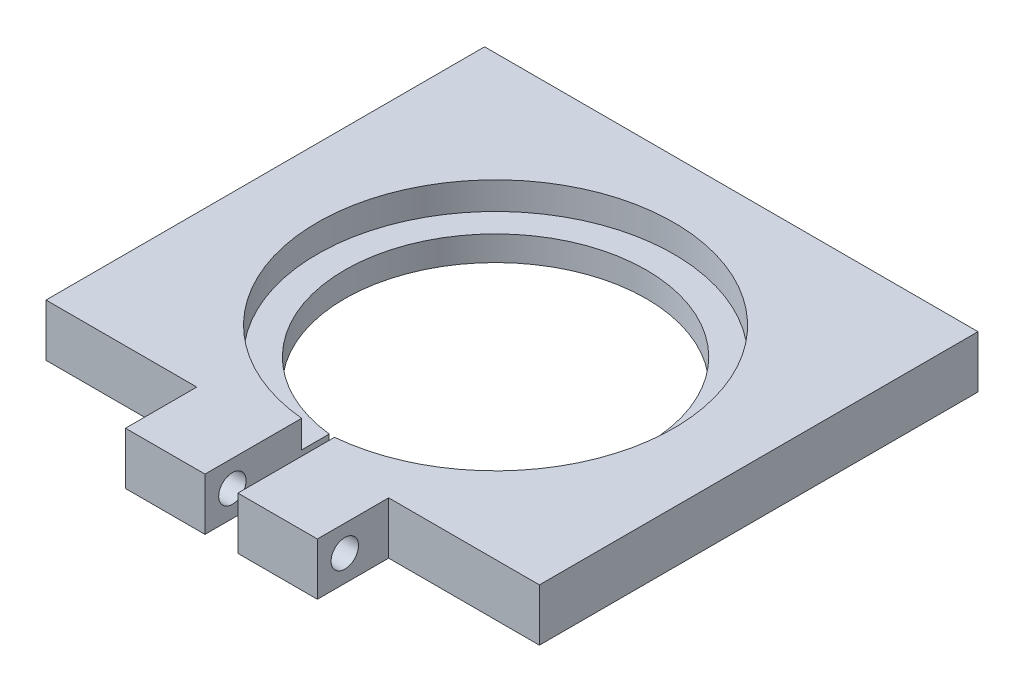
ISO-10303-21;
HEADER;
FILE_DESCRIPTION(('STEP AP214'),'2;1');
FILE_NAME('part.step','',(''),(''),'','','');
FILE_SCHEMA(('AUTOMOTIVE_DESIGN { 1 0 10303 214 1 1 1 1 }'));
ENDSEC;
DATA;
#1=APPLICATION_CONTEXT('core data for automotive mechanical design processes');
#2=APPLICATION_PROTOCOL_DEFINITION('international standard','automotive_design',2000,#1);
#3=PRODUCT_CONTEXT('',#1,'mechanical');
#4=PRODUCT('Part','Part','',(#3));
#5=PRODUCT_RELATED_PRODUCT_CATEGORY('part','',(#4));
#6=PRODUCT_DEFINITION_FORMATION('','',#4);
#7=PRODUCT_DEFINITION_CONTEXT('part definition',#1,'design');
#8=PRODUCT_DEFINITION('design','',#6,#7);
#9=PRODUCT_DEFINITION_SHAPE('','',#8);
#10=(LENGTH_UNIT() NAMED_UNIT(*) SI_UNIT(.MILLI.,.METRE.));
#11=(NAMED_UNIT(*) PLANE_ANGLE_UNIT() SI_UNIT($,.RADIAN.));
#12=(NAMED_UNIT(*) SI_UNIT($,.STERADIAN.) SOLID_ANGLE_UNIT());
#13=UNCERTAINTY_MEASURE_WITH_UNIT(LENGTH_MEASURE(1.E-05),#10,'distance_accuracy_value','');
#14=(GEOMETRIC_REPRESENTATION_CONTEXT(3) GLOBAL_UNCERTAINTY_ASSIGNED_CONTEXT((#13)) GLOBAL_UNIT_ASSIGNED_CONTEXT((#10,
#11,#12)) REPRESENTATION_CONTEXT('',''));
#15=CARTESIAN_POINT('',(0.,0.,0.));
#16=DIRECTION('',(0.,0.,1.));
#17=DIRECTION('',(1.,0.,0.));
#18=AXIS2_PLACEMENT_3D('',#15,#16,#17);
#19=CARTESIAN_POINT('',(-45.,9.53,46.5));
#20=DIRECTION('',(0.,0.,-1.));
#21=DIRECTION('',(-1.,0.,0.));
#22=AXIS2_PLACEMENT_3D('',#19,#20,#21);
#23=PLANE('',#22);
#24=DIRECTION('',(1.,0.,0.));
#25=VECTOR('',#24,1.);
#26=CARTESIAN_POINT('',(-45.,9.53,46.5));
#27=LINE('',#26,#25);
#28=CARTESIAN_POINT('',(3.00000000000001,9.53,46.5));
#29=VERTEX_POINT('',#28);
#30=CARTESIAN_POINT('',(17.5,9.53,46.5));
#31=VERTEX_POINT('',#30);
#32=EDGE_CURVE('E173',#29,#31,#27,.T.);
#33=ORIENTED_EDGE('',*,*,#32,.F.);
#34=DIRECTION('',(0.,1.,0.));
#35=VECTOR('',#34,1.);
#36=CARTESIAN_POINT('',(3.00000000000001,-0.000999999999999265,46.5));
#37=LINE('',#36,#35);
#38=CARTESIAN_POINT('',(3.00000000000001,0.,46.5));
#39=VERTEX_POINT('',#38);
#40=EDGE_CURVE('E136',#39,#29,#37,.T.);
#41=ORIENTED_EDGE('',*,*,#40,.F.);
#42=DIRECTION('',(1.,0.,0.));
#43=VECTOR('',#42,1.);
#44=CARTESIAN_POINT('',(-45.,0.,46.5));
#45=LINE('',#44,#43);
#46=CARTESIAN_POINT('',(17.5,0.,46.5));
#47=VERTEX_POINT('',#46);
#48=EDGE_CURVE('E184',#39,#47,#45,.T.);
#49=ORIENTED_EDGE('',*,*,#48,.T.);
#50=DIRECTION('',(0.,1.,0.));
#51=VECTOR('',#50,1.);
#52=CARTESIAN_POINT('',(17.5,-0.000999999999999265,46.5));
#53=LINE('',#52,#51);
#54=EDGE_CURVE('E227',#47,#31,#53,.T.);
#55=ORIENTED_EDGE('',*,*,#54,.T.);
#56=EDGE_LOOP('',(#33,#41,#49,#55));
#57=FACE_BOUND('',#56,.T.);
#58=ADVANCED_FACE('F31',(#57),#23,.F.);
#59=CARTESIAN_POINT('',(-45.,9.53,-46.5));
#60=DIRECTION('',(0.,0.,-1.));
#61=DIRECTION('',(-1.,0.,0.));
#62=AXIS2_PLACEMENT_3D('',#59,#60,#61);
#63=PLANE('',#62);
#64=CARTESIAN_POINT('',(-40.,4.765,-46.5));
#65=DIRECTION('',(0.,0.,-1.));
#66=DIRECTION('',(-1.,0.,0.));
#67=AXIS2_PLACEMENT_3D('',#64,#65,#66);
#68=CIRCLE('',#67,2.6);
#69=CARTESIAN_POINT('',(-42.6,4.765,-46.5));
#70=VERTEX_POINT('',#69);
#71=EDGE_CURVE('E239',#70,#70,#68,.T.);
#72=ORIENTED_EDGE('',*,*,#71,.F.);
#73=EDGE_LOOP('',(#72));
#74=FACE_BOUND('',#73,.T.);
#75=CARTESIAN_POINT('',(-25.,4.76000000000003,-46.5));
#76=DIRECTION('',(0.,0.,-1.));
#77=DIRECTION('',(-1.,0.,0.));
#78=AXIS2_PLACEMENT_3D('',#75,#76,#77);
#79=CIRCLE('',#78,2.6);
#80=CARTESIAN_POINT('',(-27.6,4.76000000000003,-46.5));
#81=VERTEX_POINT('',#80);
#82=EDGE_CURVE('E245',#81,#81,#79,.T.);
#83=ORIENTED_EDGE('',*,*,#82,.F.);
#84=EDGE_LOOP('',(#83));
#85=FACE_BOUND('',#84,.T.);
#86=CARTESIAN_POINT('',(25.,4.765,-46.5));
#87=DIRECTION('',(0.,0.,-1.));
#88=DIRECTION('',(-1.,0.,0.));
#89=AXIS2_PLACEMENT_3D('',#86,#87,#88);
#90=CIRCLE('',#89,2.6);
#91=CARTESIAN_POINT('',(22.4,4.765,-46.5));
#92=VERTEX_POINT('',#91);
#93=EDGE_CURVE('E251',#92,#92,#90,.T.);
#94=ORIENTED_EDGE('',*,*,#93,.F.);
#95=EDGE_LOOP('',(#94));
#96=FACE_BOUND('',#95,.T.);
#97=CARTESIAN_POINT('',(40.,4.76499999999999,-46.5));
#98=DIRECTION('',(0.,0.,-1.));
#99=DIRECTION('',(-1.,0.,0.));
#100=AXIS2_PLACEMENT_3D('',#97,#98,#99);
#101=CIRCLE('',#100,2.6);
#102=CARTESIAN_POINT('',(37.4,4.76499999999999,-46.5));
#103=VERTEX_POINT('',#102);
#104=EDGE_CURVE('E162',#103,#103,#101,.T.);
#105=ORIENTED_EDGE('',*,*,#104,.F.);
#106=EDGE_LOOP('',(#105));
#107=FACE_BOUND('',#106,.T.);
#108=DIRECTION('',(1.,0.,0.));
#109=VECTOR('',#108,1.);
#110=CARTESIAN_POINT('',(-45.,0.,-46.5));
#111=LINE('',#110,#109);
#112=CARTESIAN_POINT('',(-45.,0.,-46.5));
#113=VERTEX_POINT('',#112);
#114=CARTESIAN_POINT('',(45.,0.,-46.5));
#115=VERTEX_POINT('',#114);
#116=EDGE_CURVE('E159',#113,#115,#111,.T.);
#117=ORIENTED_EDGE('',*,*,#116,.F.);
#118=DIRECTION('',(0.,-1.,0.));
#119=VECTOR('',#118,1.);
#120=CARTESIAN_POINT('',(-45.,9.53,-46.5));
#121=LINE('',#120,#119);
#122=CARTESIAN_POINT('',(-45.,9.53,-46.5));
#123=VERTEX_POINT('',#122);
#124=EDGE_CURVE('E11',#123,#113,#121,.T.);
#125=ORIENTED_EDGE('',*,*,#124,.F.);
#126=DIRECTION('',(1.,0.,0.));
#127=VECTOR('',#126,1.);
#128=CARTESIAN_POINT('',(-45.,9.53,-46.5));
#129=LINE('',#128,#127);
#130=CARTESIAN_POINT('',(45.,9.53,-46.5));
#131=VERTEX_POINT('',#130);
#132=EDGE_CURVE('E166',#123,#131,#129,.T.);
#133=ORIENTED_EDGE('',*,*,#132,.T.);
#134=DIRECTION('',(0.,-1.,0.));
#135=VECTOR('',#134,1.);
#136=CARTESIAN_POINT('',(45.,9.53,-46.5));
#137=LINE('',#136,#135);
#138=EDGE_CURVE('E40',#131,#115,#137,.T.);
#139=ORIENTED_EDGE('',*,*,#138,.T.);
#140=EDGE_LOOP('',(#117,#125,#133,#139));
#141=FACE_BOUND('',#140,.T.);
#142=ADVANCED_FACE('F33',(#74,#85,#96,#107,#141),#63,.T.);
#143=CARTESIAN_POINT('',(-45.,9.53,-46.5));
#144=DIRECTION('',(1.,0.,0.));
#145=DIRECTION('',(0.,0.,-1.));
#146=AXIS2_PLACEMENT_3D('',#143,#144,#145);
#147=PLANE('',#146);
#148=DIRECTION('',(0.,0.,1.));
#149=VECTOR('',#148,1.);
#150=CARTESIAN_POINT('',(-45.,0.,-46.5));
#151=LINE('',#150,#149);
#152=CARTESIAN_POINT('',(-45.,0.,33.5));
#153=VERTEX_POINT('',#152);
#154=EDGE_CURVE('E170',#113,#153,#151,.T.);
#155=ORIENTED_EDGE('',*,*,#154,.T.);
#156=DIRECTION('',(0.,1.,0.));
#157=VECTOR('',#156,1.);
#158=CARTESIAN_POINT('',(-45.,-0.000999999999999265,33.5));
#159=LINE('',#158,#157);
#160=CARTESIAN_POINT('',(-45.,9.53,33.5));
#161=VERTEX_POINT('',#160);
#162=EDGE_CURVE('E211',#153,#161,#159,.T.);
#163=ORIENTED_EDGE('',*,*,#162,.T.);
#164=DIRECTION('',(0.,0.,1.));
#165=VECTOR('',#164,1.);
#166=CARTESIAN_POINT('',(-45.,9.53,-46.5));
#167=LINE('',#166,#165);
#168=EDGE_CURVE('E176',#123,#161,#167,.T.);
#169=ORIENTED_EDGE('',*,*,#168,.F.);
#170=ORIENTED_EDGE('',*,*,#124,.T.);
#171=EDGE_LOOP('',(#155,#163,#169,#170));
#172=FACE_BOUND('',#171,.T.);
#173=ADVANCED_FACE('F209',(#172),#147,.F.);
#174=CARTESIAN_POINT('',(-17.5,0.,46.5));
#175=VERTEX_POINT('',#174);
#176=CARTESIAN_POINT('',(-2.99999999999999,0.,46.5));
#177=VERTEX_POINT('',#176);
#178=EDGE_CURVE('E185',#175,#177,#45,.T.);
#179=ORIENTED_EDGE('',*,*,#178,.T.);
#180=DIRECTION('',(0.,1.,0.));
#181=VECTOR('',#180,1.);
#182=CARTESIAN_POINT('',(-2.99999999999999,-0.000999999999999265,46.5));
#183=LINE('',#182,#181);
#184=CARTESIAN_POINT('',(-2.99999999999999,9.53,46.5));
#185=VERTEX_POINT('',#184);
#186=EDGE_CURVE('E504',#177,#185,#183,.T.);
#187=ORIENTED_EDGE('',*,*,#186,.T.);
#188=CARTESIAN_POINT('',(-17.5,9.53,46.5));
#189=VERTEX_POINT('',#188);
#190=EDGE_CURVE('E174',#189,#185,#27,.T.);
#191=ORIENTED_EDGE('',*,*,#190,.F.);
#192=DIRECTION('',(0.,1.,0.));
#193=VECTOR('',#192,1.);
#194=CARTESIAN_POINT('',(-17.5,-0.000999999999999265,46.5));
#195=LINE('',#194,#193);
#196=EDGE_CURVE('E522',#175,#189,#195,.T.);
#197=ORIENTED_EDGE('',*,*,#196,.F.);
#198=EDGE_LOOP('',(#179,#187,#191,#197));
#199=FACE_BOUND('',#198,.T.);
#200=ADVANCED_FACE('F269',(#199),#23,.F.);
#201=CARTESIAN_POINT('',(45.,9.53,-46.5));
#202=DIRECTION('',(1.,0.,0.));
#203=DIRECTION('',(0.,0.,-1.));
#204=AXIS2_PLACEMENT_3D('',#201,#202,#203);
#205=PLANE('',#204);
#206=DIRECTION('',(0.,1.,0.));
#207=VECTOR('',#206,1.);
#208=CARTESIAN_POINT('',(45.,-0.000999999999999265,33.5));
#209=LINE('',#208,#207);
#210=CARTESIAN_POINT('',(45.,0.,33.5));
#211=VERTEX_POINT('',#210);
#212=CARTESIAN_POINT('',(45.,9.53,33.5));
#213=VERTEX_POINT('',#212);
#214=EDGE_CURVE('E197',#211,#213,#209,.T.);
#215=ORIENTED_EDGE('',*,*,#214,.F.);
#216=DIRECTION('',(0.,0.,1.));
#217=VECTOR('',#216,1.);
#218=CARTESIAN_POINT('',(45.,0.,-46.5));
#219=LINE('',#218,#217);
#220=EDGE_CURVE('E181',#115,#211,#219,.T.);
#221=ORIENTED_EDGE('',*,*,#220,.F.);
#222=ORIENTED_EDGE('',*,*,#138,.F.);
#223=DIRECTION('',(0.,0.,1.));
#224=VECTOR('',#223,1.);
#225=CARTESIAN_POINT('',(45.,9.53,-46.5));
#226=LINE('',#225,#224);
#227=EDGE_CURVE('E169',#131,#213,#226,.T.);
#228=ORIENTED_EDGE('',*,*,#227,.T.);
#229=EDGE_LOOP('',(#215,#221,#222,#228));
#230=FACE_BOUND('',#229,.T.);
#231=ADVANCED_FACE('F196',(#230),#205,.T.);
#232=CARTESIAN_POINT('',(45.,9.53,-46.5));
#233=DIRECTION('',(0.,-1.,0.));
#234=DIRECTION('',(0.,0.,-1.));
#235=AXIS2_PLACEMENT_3D('',#232,#233,#234);
#236=PLANE('',#235);
#237=CARTESIAN_POINT('',(0.,9.53,-3.49999999999999));
#238=DIRECTION('',(0.,1.,0.));
#239=DIRECTION('',(0.,0.,1.));
#240=AXIS2_PLACEMENT_3D('',#237,#238,#239);
#241=CIRCLE('',#240,32.51);
#242=CARTESIAN_POINT('',(3.00000000000001,9.53,28.8712851150522));
#243=VERTEX_POINT('',#242);
#244=CARTESIAN_POINT('',(-2.99999999999999,9.53,28.8712851150522));
#245=VERTEX_POINT('',#244);
#246=EDGE_CURVE('E148',#243,#245,#241,.T.);
#247=ORIENTED_EDGE('',*,*,#246,.F.);
#248=DIRECTION('',(0.,0.,-1.));
#249=VECTOR('',#248,1.);
#250=CARTESIAN_POINT('',(3.00000000000001,9.53,46.5));
#251=LINE('',#250,#249);
#252=EDGE_CURVE('E131',#29,#243,#251,.T.);
#253=ORIENTED_EDGE('',*,*,#252,.F.);
#254=ORIENTED_EDGE('',*,*,#32,.T.);
#255=DIRECTION('',(0.,0.,1.));
#256=VECTOR('',#255,1.);
#257=CARTESIAN_POINT('',(17.5,9.53,46.5));
#258=LINE('',#257,#256);
#259=CARTESIAN_POINT('',(17.5,9.53,33.5));
#260=VERTEX_POINT('',#259);
#261=EDGE_CURVE('E218',#260,#31,#258,.T.);
#262=ORIENTED_EDGE('',*,*,#261,.F.);
#263=DIRECTION('',(-1.,0.,0.));
#264=VECTOR('',#263,1.);
#265=CARTESIAN_POINT('',(45.,9.53,33.5));
#266=LINE('',#265,#264);
#267=EDGE_CURVE('E216',#213,#260,#266,.T.);
#268=ORIENTED_EDGE('',*,*,#267,.F.);
#269=ORIENTED_EDGE('',*,*,#227,.F.);
#270=ORIENTED_EDGE('',*,*,#132,.F.);
#271=ORIENTED_EDGE('',*,*,#168,.T.);
#272=DIRECTION('',(-1.,0.,0.));
#273=VECTOR('',#272,1.);
#274=CARTESIAN_POINT('',(-45.,9.53,33.5));
#275=LINE('',#274,#273);
#276=CARTESIAN_POINT('',(-17.5,9.53,33.5));
#277=VERTEX_POINT('',#276);
#278=EDGE_CURVE('E520',#277,#161,#275,.T.);
#279=ORIENTED_EDGE('',*,*,#278,.F.);
#280=DIRECTION('',(0.,0.,-1.));
#281=VECTOR('',#280,1.);
#282=CARTESIAN_POINT('',(-17.5,9.53,46.5));
#283=LINE('',#282,#281);
#284=EDGE_CURVE('E517',#189,#277,#283,.T.);
#285=ORIENTED_EDGE('',*,*,#284,.F.);
#286=ORIENTED_EDGE('',*,*,#190,.T.);
#287=DIRECTION('',(0.,0.,1.));
#288=VECTOR('',#287,1.);
#289=CARTESIAN_POINT('',(-2.99999999999999,9.53,46.5));
#290=LINE('',#289,#288);
#291=EDGE_CURVE('E140',#245,#185,#290,.T.);
#292=ORIENTED_EDGE('',*,*,#291,.F.);
#293=EDGE_LOOP('',(#247,#253,#254,#262,#268,#269,#270,#271,#279,#285,#286,#292));
#294=FACE_BOUND('',#293,.T.);
#295=ADVANCED_FACE('F155',(#294),#236,.F.);
#296=CARTESIAN_POINT('',(45.,0.,-46.5));
#297=DIRECTION('',(0.,-1.,0.));
#298=DIRECTION('',(0.,0.,-1.));
#299=AXIS2_PLACEMENT_3D('',#296,#297,#298);
#300=PLANE('',#299);
#301=DIRECTION('',(0.,0.,-1.));
#302=VECTOR('',#301,1.);
#303=CARTESIAN_POINT('',(3.00000000000001,0.,46.5));
#304=LINE('',#303,#302);
#305=CARTESIAN_POINT('',(3.00000000000001,0.,23.8358738656733));
#306=VERTEX_POINT('',#305);
#307=EDGE_CURVE('E141',#39,#306,#304,.T.);
#308=ORIENTED_EDGE('',*,*,#307,.T.);
#309=CARTESIAN_POINT('',(0.,0.,-3.49999999999999));
#310=DIRECTION('',(0.,-1.,0.));
#311=DIRECTION('',(0.,0.,-1.));
#312=AXIS2_PLACEMENT_3D('',#309,#310,#311);
#313=CIRCLE('',#312,27.5);
#314=CARTESIAN_POINT('',(-2.99999999999999,0.,23.8358738656733));
#315=VERTEX_POINT('',#314);
#316=EDGE_CURVE('E235',#306,#315,#313,.F.);
#317=ORIENTED_EDGE('',*,*,#316,.T.);
#318=DIRECTION('',(0.,0.,1.));
#319=VECTOR('',#318,1.);
#320=CARTESIAN_POINT('',(-2.99999999999999,0.,46.5));
#321=LINE('',#320,#319);
#322=EDGE_CURVE('E56',#315,#177,#321,.T.);
#323=ORIENTED_EDGE('',*,*,#322,.T.);
#324=ORIENTED_EDGE('',*,*,#178,.F.);
#325=DIRECTION('',(0.,0.,-1.));
#326=VECTOR('',#325,1.);
#327=CARTESIAN_POINT('',(-17.5,0.,46.5));
#328=LINE('',#327,#326);
#329=CARTESIAN_POINT('',(-17.5,0.,33.5));
#330=VERTEX_POINT('',#329);
#331=EDGE_CURVE('E514',#175,#330,#328,.T.);
#332=ORIENTED_EDGE('',*,*,#331,.T.);
#333=DIRECTION('',(-1.,0.,0.));
#334=VECTOR('',#333,1.);
#335=CARTESIAN_POINT('',(-45.,0.,33.5));
#336=LINE('',#335,#334);
#337=EDGE_CURVE('E206',#330,#153,#336,.T.);
#338=ORIENTED_EDGE('',*,*,#337,.T.);
#339=ORIENTED_EDGE('',*,*,#154,.F.);
#340=ORIENTED_EDGE('',*,*,#116,.T.);
#341=ORIENTED_EDGE('',*,*,#220,.T.);
#342=DIRECTION('',(-1.,0.,0.));
#343=VECTOR('',#342,1.);
#344=CARTESIAN_POINT('',(45.,0.,33.5));
#345=LINE('',#344,#343);
#346=CARTESIAN_POINT('',(17.5,0.,33.5));
#347=VERTEX_POINT('',#346);
#348=EDGE_CURVE('E230',#211,#347,#345,.T.);
#349=ORIENTED_EDGE('',*,*,#348,.T.);
#350=DIRECTION('',(0.,0.,1.));
#351=VECTOR('',#350,1.);
#352=CARTESIAN_POINT('',(17.5,0.,46.5));
#353=LINE('',#352,#351);
#354=EDGE_CURVE('E220',#347,#47,#353,.T.);
#355=ORIENTED_EDGE('',*,*,#354,.T.);
#356=ORIENTED_EDGE('',*,*,#48,.F.);
#357=EDGE_LOOP('',(#308,#317,#323,#324,#332,#338,#339,#340,#341,#349,#355,#356));
#358=FACE_BOUND('',#357,.T.);
#359=ADVANCED_FACE('F202',(#358),#300,.T.);
#360=CARTESIAN_POINT('',(0.,4.53,-3.49999999999999));
#361=DIRECTION('',(0.,1.,0.));
#362=DIRECTION('',(0.,0.,1.));
#363=AXIS2_PLACEMENT_3D('',#360,#361,#362);
#364=CYLINDRICAL_SURFACE('',#363,32.51);
#365=CARTESIAN_POINT('',(0.,4.53,-3.49999999999999));
#366=DIRECTION('',(0.,1.,0.));
#367=DIRECTION('',(0.,0.,1.));
#368=AXIS2_PLACEMENT_3D('',#365,#366,#367);
#369=CIRCLE('',#368,32.51);
#370=CARTESIAN_POINT('',(3.00000000000001,4.53,28.8712851150522));
#371=VERTEX_POINT('',#370);
#372=CARTESIAN_POINT('',(-2.99999999999999,4.53,28.8712851150522));
#373=VERTEX_POINT('',#372);
#374=EDGE_CURVE('E150',#371,#373,#369,.T.);
#375=ORIENTED_EDGE('',*,*,#374,.F.);
#376=DIRECTION('',(0.,1.,0.));
#377=VECTOR('',#376,1.);
#378=CARTESIAN_POINT('',(3.00000000000001,4.53,28.8712851150522));
#379=LINE('',#378,#377);
#380=EDGE_CURVE('E134',#243,#371,#379,.F.);
#381=ORIENTED_EDGE('',*,*,#380,.F.);
#382=ORIENTED_EDGE('',*,*,#246,.T.);
#383=DIRECTION('',(0.,1.,0.));
#384=VECTOR('',#383,1.);
#385=CARTESIAN_POINT('',(-2.99999999999999,4.53,28.8712851150522));
#386=LINE('',#385,#384);
#387=EDGE_CURVE('E152',#373,#245,#386,.T.);
#388=ORIENTED_EDGE('',*,*,#387,.F.);
#389=EDGE_LOOP('',(#375,#381,#382,#388));
#390=FACE_BOUND('',#389,.T.);
#391=ADVANCED_FACE('F146',(#390),#364,.F.);
#392=CARTESIAN_POINT('',(0.,4.53,-3.49999999999999));
#393=DIRECTION('',(0.,1.,0.));
#394=DIRECTION('',(0.,0.,1.));
#395=AXIS2_PLACEMENT_3D('',#392,#393,#394);
#396=PLANE('',#395);
#397=DIRECTION('',(0.,0.,1.));
#398=VECTOR('',#397,1.);
#399=CARTESIAN_POINT('',(3.00000000000001,4.53,46.5));
#400=LINE('',#399,#398);
#401=CARTESIAN_POINT('',(3.00000000000001,4.53,23.8358738656733));
#402=VERTEX_POINT('',#401);
#403=EDGE_CURVE('E48',#402,#371,#400,.T.);
#404=ORIENTED_EDGE('',*,*,#403,.T.);
#405=ORIENTED_EDGE('',*,*,#374,.T.);
#406=DIRECTION('',(0.,0.,-1.));
#407=VECTOR('',#406,1.);
#408=CARTESIAN_POINT('',(-2.99999999999999,4.53,46.5));
#409=LINE('',#408,#407);
#410=CARTESIAN_POINT('',(-2.99999999999999,4.53,23.8358738656733));
#411=VERTEX_POINT('',#410);
#412=EDGE_CURVE('E510',#373,#411,#409,.T.);
#413=ORIENTED_EDGE('',*,*,#412,.T.);
#414=CARTESIAN_POINT('',(0.,4.53,-3.49999999999999));
#415=DIRECTION('',(0.,1.,0.));
#416=DIRECTION('',(0.,0.,1.));
#417=AXIS2_PLACEMENT_3D('',#414,#415,#416);
#418=CIRCLE('',#417,27.5);
#419=EDGE_CURVE('E236',#402,#411,#418,.T.);
#420=ORIENTED_EDGE('',*,*,#419,.F.);
#421=EDGE_LOOP('',(#404,#405,#413,#420));
#422=FACE_BOUND('',#421,.T.);
#423=ADVANCED_FACE('F299',(#422),#396,.T.);
#424=CARTESIAN_POINT('',(40.,4.76499999999999,-27.5));
#425=DIRECTION('',(0.,0.,-1.));
#426=DIRECTION('',(-1.,0.,0.));
#427=AXIS2_PLACEMENT_3D('',#424,#425,#426);
#428=CYLINDRICAL_SURFACE('',#427,2.6);
#429=CARTESIAN_POINT('',(40.,4.76499999999999,-27.5));
#430=DIRECTION('',(0.,0.,-1.));
#431=DIRECTION('',(-1.,0.,0.));
#432=AXIS2_PLACEMENT_3D('',#429,#430,#431);
#433=CIRCLE('',#432,2.6);
#434=CARTESIAN_POINT('',(37.4,4.76499999999999,-27.5));
#435=VERTEX_POINT('',#434);
#436=EDGE_CURVE('E157',#435,#435,#433,.T.);
#437=ORIENTED_EDGE('',*,*,#436,.F.);
#438=EDGE_LOOP('',(#437));
#439=FACE_BOUND('',#438,.T.);
#440=ORIENTED_EDGE('',*,*,#104,.T.);
#441=EDGE_LOOP('',(#440));
#442=FACE_BOUND('',#441,.T.);
#443=ADVANCED_FACE('F261',(#439,#442),#428,.F.);
#444=CARTESIAN_POINT('',(40.,4.76499999999999,-27.5));
#445=DIRECTION('',(0.,0.,-1.));
#446=DIRECTION('',(-1.,0.,0.));
#447=AXIS2_PLACEMENT_3D('',#444,#445,#446);
#448=PLANE('',#447);
#449=ORIENTED_EDGE('',*,*,#436,.T.);
#450=EDGE_LOOP('',(#449));
#451=FACE_BOUND('',#450,.T.);
#452=ADVANCED_FACE('F282',(#451),#448,.T.);
#453=CARTESIAN_POINT('',(25.,4.765,-27.5));
#454=DIRECTION('',(0.,0.,-1.));
#455=DIRECTION('',(-1.,0.,0.));
#456=AXIS2_PLACEMENT_3D('',#453,#454,#455);
#457=CYLINDRICAL_SURFACE('',#456,2.6);
#458=CARTESIAN_POINT('',(25.,4.765,-27.5));
#459=DIRECTION('',(0.,0.,-1.));
#460=DIRECTION('',(-1.,0.,0.));
#461=AXIS2_PLACEMENT_3D('',#458,#459,#460);
#462=CIRCLE('',#461,2.6);
#463=CARTESIAN_POINT('',(22.4,4.765,-27.5));
#464=VERTEX_POINT('',#463);
#465=EDGE_CURVE('E254',#464,#464,#462,.T.);
#466=ORIENTED_EDGE('',*,*,#465,.F.);
#467=EDGE_LOOP('',(#466));
#468=FACE_BOUND('',#467,.T.);
#469=ORIENTED_EDGE('',*,*,#93,.T.);
#470=EDGE_LOOP('',(#469));
#471=FACE_BOUND('',#470,.T.);
#472=ADVANCED_FACE('F279',(#468,#471),#457,.F.);
#473=CARTESIAN_POINT('',(25.,4.765,-27.5));
#474=DIRECTION('',(0.,0.,-1.));
#475=DIRECTION('',(-1.,0.,0.));
#476=AXIS2_PLACEMENT_3D('',#473,#474,#475);
#477=PLANE('',#476);
#478=ORIENTED_EDGE('',*,*,#465,.T.);
#479=EDGE_LOOP('',(#478));
#480=FACE_BOUND('',#479,.T.);
#481=ADVANCED_FACE('F281',(#480),#477,.T.);
#482=CARTESIAN_POINT('',(-25.,4.76000000000003,-27.5));
#483=DIRECTION('',(0.,0.,-1.));
#484=DIRECTION('',(-1.,0.,0.));
#485=AXIS2_PLACEMENT_3D('',#482,#483,#484);
#486=CYLINDRICAL_SURFACE('',#485,2.6);
#487=CARTESIAN_POINT('',(-25.,4.76000000000003,-27.5));
#488=DIRECTION('',(0.,0.,-1.));
#489=DIRECTION('',(-1.,0.,0.));
#490=AXIS2_PLACEMENT_3D('',#487,#488,#489);
#491=CIRCLE('',#490,2.6);
#492=CARTESIAN_POINT('',(-27.6,4.76000000000003,-27.5));
#493=VERTEX_POINT('',#492);
#494=EDGE_CURVE('E248',#493,#493,#491,.T.);
#495=ORIENTED_EDGE('',*,*,#494,.F.);
#496=EDGE_LOOP('',(#495));
#497=FACE_BOUND('',#496,.T.);
#498=ORIENTED_EDGE('',*,*,#82,.T.);
#499=EDGE_LOOP('',(#498));
#500=FACE_BOUND('',#499,.T.);
#501=ADVANCED_FACE('F289',(#497,#500),#486,.F.);
#502=CARTESIAN_POINT('',(-25.,4.76000000000003,-27.5));
#503=DIRECTION('',(0.,0.,-1.));
#504=DIRECTION('',(-1.,0.,0.));
#505=AXIS2_PLACEMENT_3D('',#502,#503,#504);
#506=PLANE('',#505);
#507=ORIENTED_EDGE('',*,*,#494,.T.);
#508=EDGE_LOOP('',(#507));
#509=FACE_BOUND('',#508,.T.);
#510=ADVANCED_FACE('F362',(#509),#506,.T.);
#511=CARTESIAN_POINT('',(-40.,4.765,-27.5));
#512=DIRECTION('',(0.,0.,-1.));
#513=DIRECTION('',(-1.,0.,0.));
#514=AXIS2_PLACEMENT_3D('',#511,#512,#513);
#515=CYLINDRICAL_SURFACE('',#514,2.6);
#516=CARTESIAN_POINT('',(-40.,4.765,-27.5));
#517=DIRECTION('',(0.,0.,-1.));
#518=DIRECTION('',(-1.,0.,0.));
#519=AXIS2_PLACEMENT_3D('',#516,#517,#518);
#520=CIRCLE('',#519,2.6);
#521=CARTESIAN_POINT('',(-42.6,4.765,-27.5));
#522=VERTEX_POINT('',#521);
#523=EDGE_CURVE('E242',#522,#522,#520,.T.);
#524=ORIENTED_EDGE('',*,*,#523,.F.);
#525=EDGE_LOOP('',(#524));
#526=FACE_BOUND('',#525,.T.);
#527=ORIENTED_EDGE('',*,*,#71,.T.);
#528=EDGE_LOOP('',(#527));
#529=FACE_BOUND('',#528,.T.);
#530=ADVANCED_FACE('F371',(#526,#529),#515,.F.);
#531=CARTESIAN_POINT('',(-40.,4.765,-27.5));
#532=DIRECTION('',(0.,0.,-1.));
#533=DIRECTION('',(-1.,0.,0.));
#534=AXIS2_PLACEMENT_3D('',#531,#532,#533);
#535=PLANE('',#534);
#536=ORIENTED_EDGE('',*,*,#523,.T.);
#537=EDGE_LOOP('',(#536));
#538=FACE_BOUND('',#537,.T.);
#539=ADVANCED_FACE('F381',(#538),#535,.T.);
#540=CARTESIAN_POINT('',(0.,-0.00100000000000013,-3.49999999999999));
#541=DIRECTION('',(0.,1.,0.));
#542=DIRECTION('',(0.,0.,1.));
#543=AXIS2_PLACEMENT_3D('',#540,#541,#542);
#544=CYLINDRICAL_SURFACE('',#543,27.5);
#545=ORIENTED_EDGE('',*,*,#316,.F.);
#546=DIRECTION('',(0.,1.,0.));
#547=VECTOR('',#546,1.);
#548=CARTESIAN_POINT('',(3.00000000000001,-0.00100000000000013,23.8358738656733));
#549=LINE('',#548,#547);
#550=EDGE_CURVE('E151',#402,#306,#549,.F.);
#551=ORIENTED_EDGE('',*,*,#550,.F.);
#552=ORIENTED_EDGE('',*,*,#419,.T.);
#553=DIRECTION('',(0.,1.,0.));
#554=VECTOR('',#553,1.);
#555=CARTESIAN_POINT('',(-2.99999999999999,-0.00100000000000013,23.8358738656733));
#556=LINE('',#555,#554);
#557=EDGE_CURVE('E506',#315,#411,#556,.T.);
#558=ORIENTED_EDGE('',*,*,#557,.F.);
#559=EDGE_LOOP('',(#545,#551,#552,#558));
#560=FACE_BOUND('',#559,.T.);
#561=ADVANCED_FACE('F390',(#560),#544,.F.);
#562=CARTESIAN_POINT('',(17.5,-0.000999999999999265,46.5));
#563=DIRECTION('',(-1.,0.,0.));
#564=DIRECTION('',(0.,0.,1.));
#565=AXIS2_PLACEMENT_3D('',#562,#563,#564);
#566=PLANE('',#565);
#567=CARTESIAN_POINT('',(17.5,4.765,41.5));
#568=DIRECTION('',(-1.,0.,0.));
#569=DIRECTION('',(0.,0.,1.));
#570=AXIS2_PLACEMENT_3D('',#567,#568,#569);
#571=CIRCLE('',#570,2.5);
#572=CARTESIAN_POINT('',(17.5,4.765,44.));
#573=VERTEX_POINT('',#572);
#574=EDGE_CURVE('E496',#573,#573,#571,.F.);
#575=ORIENTED_EDGE('',*,*,#574,.F.);
#576=EDGE_LOOP('',(#575));
#577=FACE_BOUND('',#576,.T.);
#578=DIRECTION('',(0.,1.,0.));
#579=VECTOR('',#578,1.);
#580=CARTESIAN_POINT('',(17.5,-0.000999999999999265,33.5));
#581=LINE('',#580,#579);
#582=EDGE_CURVE('E231',#347,#260,#581,.T.);
#583=ORIENTED_EDGE('',*,*,#582,.T.);
#584=ORIENTED_EDGE('',*,*,#261,.T.);
#585=ORIENTED_EDGE('',*,*,#54,.F.);
#586=ORIENTED_EDGE('',*,*,#354,.F.);
#587=EDGE_LOOP('',(#583,#584,#585,#586));
#588=FACE_BOUND('',#587,.T.);
#589=ADVANCED_FACE('F446',(#577,#588),#566,.F.);
#590=CARTESIAN_POINT('',(45.,-0.000999999999999265,33.5));
#591=DIRECTION('',(0.,0.,-1.));
#592=DIRECTION('',(-1.,0.,0.));
#593=AXIS2_PLACEMENT_3D('',#590,#591,#592);
#594=PLANE('',#593);
#595=ORIENTED_EDGE('',*,*,#214,.T.);
#596=ORIENTED_EDGE('',*,*,#267,.T.);
#597=ORIENTED_EDGE('',*,*,#582,.F.);
#598=ORIENTED_EDGE('',*,*,#348,.F.);
#599=EDGE_LOOP('',(#595,#596,#597,#598));
#600=FACE_BOUND('',#599,.T.);
#601=ADVANCED_FACE('F436',(#600),#594,.F.);
#602=CARTESIAN_POINT('',(-45.,-0.000999999999999265,33.5));
#603=DIRECTION('',(0.,0.,-1.));
#604=DIRECTION('',(-1.,0.,0.));
#605=AXIS2_PLACEMENT_3D('',#602,#603,#604);
#606=PLANE('',#605);
#607=DIRECTION('',(0.,1.,0.));
#608=VECTOR('',#607,1.);
#609=CARTESIAN_POINT('',(-17.5,-0.000999999999999265,33.5));
#610=LINE('',#609,#608);
#611=EDGE_CURVE('E524',#330,#277,#610,.T.);
#612=ORIENTED_EDGE('',*,*,#611,.T.);
#613=ORIENTED_EDGE('',*,*,#278,.T.);
#614=ORIENTED_EDGE('',*,*,#162,.F.);
#615=ORIENTED_EDGE('',*,*,#337,.F.);
#616=EDGE_LOOP('',(#612,#613,#614,#615));
#617=FACE_BOUND('',#616,.T.);
#618=ADVANCED_FACE('F431',(#617),#606,.F.);
#619=CARTESIAN_POINT('',(-17.5,-0.000999999999999265,46.5));
#620=DIRECTION('',(1.,0.,0.));
#621=DIRECTION('',(0.,0.,-1.));
#622=AXIS2_PLACEMENT_3D('',#619,#620,#621);
#623=PLANE('',#622);
#624=CARTESIAN_POINT('',(-17.5,4.765,41.5));
#625=DIRECTION('',(-1.,0.,0.));
#626=DIRECTION('',(0.,0.,1.));
#627=AXIS2_PLACEMENT_3D('',#624,#625,#626);
#628=CIRCLE('',#627,2.5);
#629=CARTESIAN_POINT('',(-17.5,4.765,44.));
#630=VERTEX_POINT('',#629);
#631=EDGE_CURVE('E489',#630,#630,#628,.T.);
#632=ORIENTED_EDGE('',*,*,#631,.F.);
#633=EDGE_LOOP('',(#632));
#634=FACE_BOUND('',#633,.T.);
#635=ORIENTED_EDGE('',*,*,#196,.T.);
#636=ORIENTED_EDGE('',*,*,#284,.T.);
#637=ORIENTED_EDGE('',*,*,#611,.F.);
#638=ORIENTED_EDGE('',*,*,#331,.F.);
#639=EDGE_LOOP('',(#635,#636,#637,#638));
#640=FACE_BOUND('',#639,.T.);
#641=ADVANCED_FACE('F435',(#634,#640),#623,.F.);
#642=CARTESIAN_POINT('',(-2.99999999999999,-0.000999999999999265,46.5));
#643=DIRECTION('',(-1.,0.,0.));
#644=DIRECTION('',(0.,0.,1.));
#645=AXIS2_PLACEMENT_3D('',#642,#643,#644);
#646=PLANE('',#645);
#647=CARTESIAN_POINT('',(-3.,4.765,41.5));
#648=DIRECTION('',(-1.,0.,0.));
#649=DIRECTION('',(0.,0.,1.));
#650=AXIS2_PLACEMENT_3D('',#647,#648,#649);
#651=CIRCLE('',#650,2.5);
#652=CARTESIAN_POINT('',(-3.,4.765,44.));
#653=VERTEX_POINT('',#652);
#654=EDGE_CURVE('E492',#653,#653,#651,.T.);
#655=ORIENTED_EDGE('',*,*,#654,.T.);
#656=EDGE_LOOP('',(#655));
#657=FACE_BOUND('',#656,.T.);
#658=ORIENTED_EDGE('',*,*,#557,.T.);
#659=ORIENTED_EDGE('',*,*,#412,.F.);
#660=ORIENTED_EDGE('',*,*,#387,.T.);
#661=ORIENTED_EDGE('',*,*,#291,.T.);
#662=ORIENTED_EDGE('',*,*,#186,.F.);
#663=ORIENTED_EDGE('',*,*,#322,.F.);
#664=EDGE_LOOP('',(#658,#659,#660,#661,#662,#663));
#665=FACE_BOUND('',#664,.T.);
#666=ADVANCED_FACE('F469',(#657,#665),#646,.F.);
#667=CARTESIAN_POINT('',(3.00000000000001,-0.000999999999999265,46.5));
#668=DIRECTION('',(1.,0.,0.));
#669=DIRECTION('',(0.,0.,-1.));
#670=AXIS2_PLACEMENT_3D('',#667,#668,#669);
#671=PLANE('',#670);
#672=CARTESIAN_POINT('',(3.00000000000001,4.765,41.5));
#673=DIRECTION('',(1.,0.,0.));
#674=DIRECTION('',(0.,0.,-1.));
#675=AXIS2_PLACEMENT_3D('',#672,#673,#674);
#676=CIRCLE('',#675,2.5);
#677=CARTESIAN_POINT('',(3.00000000000001,4.765,39.));
#678=VERTEX_POINT('',#677);
#679=EDGE_CURVE('E35',#678,#678,#676,.T.);
#680=ORIENTED_EDGE('',*,*,#679,.T.);
#681=EDGE_LOOP('',(#680));
#682=FACE_BOUND('',#681,.T.);
#683=ORIENTED_EDGE('',*,*,#40,.T.);
#684=ORIENTED_EDGE('',*,*,#252,.T.);
#685=ORIENTED_EDGE('',*,*,#380,.T.);
#686=ORIENTED_EDGE('',*,*,#403,.F.);
#687=ORIENTED_EDGE('',*,*,#550,.T.);
#688=ORIENTED_EDGE('',*,*,#307,.F.);
#689=EDGE_LOOP('',(#683,#684,#685,#686,#687,#688));
#690=FACE_BOUND('',#689,.T.);
#691=ADVANCED_FACE('F133',(#682,#690),#671,.F.);
#692=CARTESIAN_POINT('',(24.5710678118655,4.765,41.5));
#693=DIRECTION('',(-1.,0.,0.));
#694=DIRECTION('',(0.,0.,1.));
#695=AXIS2_PLACEMENT_3D('',#692,#693,#694);
#696=CYLINDRICAL_SURFACE('',#695,2.5);
#697=ORIENTED_EDGE('',*,*,#574,.T.);
#698=EDGE_LOOP('',(#697));
#699=FACE_BOUND('',#698,.T.);
#700=ORIENTED_EDGE('',*,*,#679,.F.);
#701=EDGE_LOOP('',(#700));
#702=FACE_BOUND('',#701,.T.);
#703=ADVANCED_FACE('F474',(#699,#702),#696,.F.);
#704=ORIENTED_EDGE('',*,*,#631,.T.);
#705=EDGE_LOOP('',(#704));
#706=FACE_BOUND('',#705,.T.);
#707=ORIENTED_EDGE('',*,*,#654,.F.);
#708=EDGE_LOOP('',(#707));
#709=FACE_BOUND('',#708,.T.);
#710=ADVANCED_FACE('F479',(#706,#709),#696,.F.);
#711=CLOSED_SHELL('',(#58,#142,#173,#200,#231,#295,#359,#391,#423,#443,#452,#472,#481,#501,#510,
#530,#539,#561,#589,#601,#618,#641,#666,#691,#703,#710));
#712=MANIFOLD_SOLID_BREP('B2',#711);
#713=ADVANCED_BREP_SHAPE_REPRESENTATION('',(#18,#712),#14);
#714=SHAPE_DEFINITION_REPRESENTATION(#9,#713);
ENDSEC;
END-ISO-10303-21;
